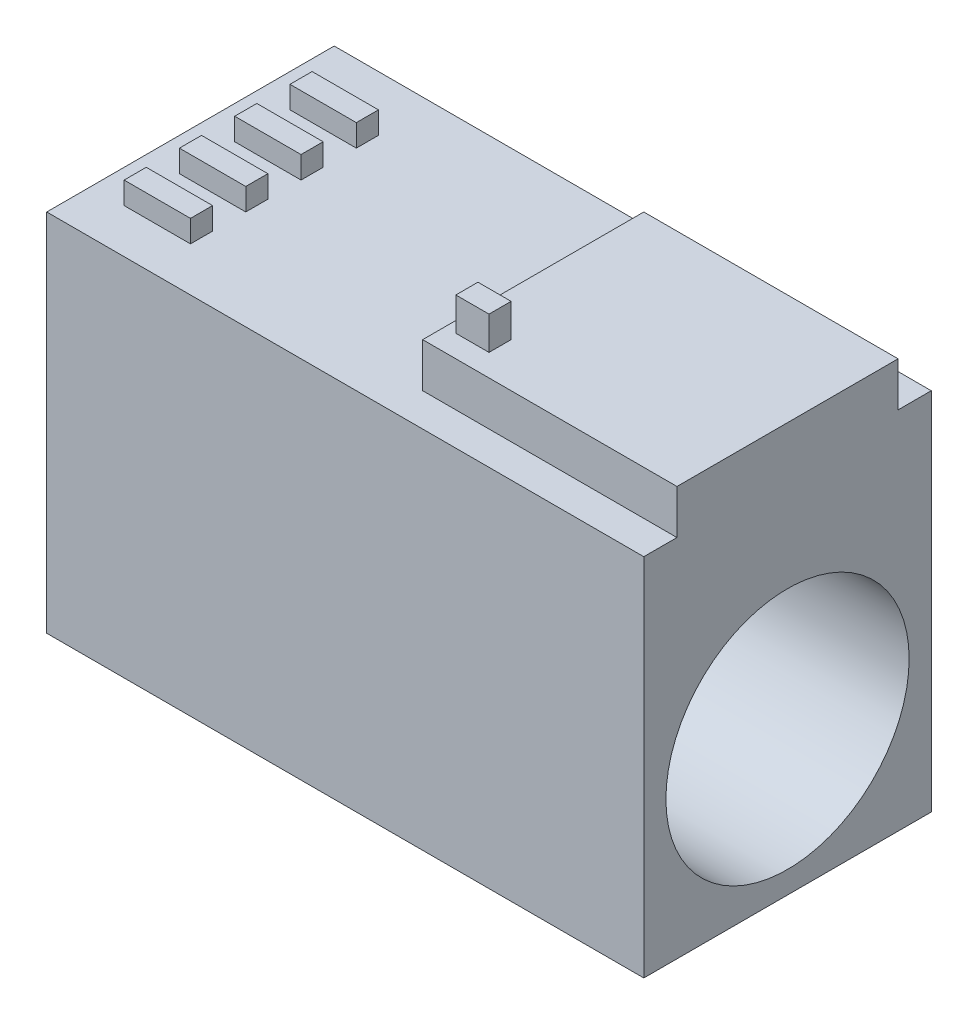
ISO-10303-21;
HEADER;
FILE_DESCRIPTION(('STEP AP214'),'2;1');
FILE_NAME('part.step','',(''),(''),'','','');
FILE_SCHEMA(('AUTOMOTIVE_DESIGN { 1 0 10303 214 1 1 1 1 }'));
ENDSEC;
DATA;
#1=APPLICATION_CONTEXT('core data for automotive mechanical design processes');
#2=APPLICATION_PROTOCOL_DEFINITION('international standard','automotive_design',2000,#1);
#3=PRODUCT_CONTEXT('',#1,'mechanical');
#4=PRODUCT('Part','Part','',(#3));
#5=PRODUCT_RELATED_PRODUCT_CATEGORY('part','',(#4));
#6=PRODUCT_DEFINITION_FORMATION('','',#4);
#7=PRODUCT_DEFINITION_CONTEXT('part definition',#1,'design');
#8=PRODUCT_DEFINITION('design','',#6,#7);
#9=PRODUCT_DEFINITION_SHAPE('','',#8);
#10=(LENGTH_UNIT() NAMED_UNIT(*) SI_UNIT(.MILLI.,.METRE.));
#11=(NAMED_UNIT(*) PLANE_ANGLE_UNIT() SI_UNIT($,.RADIAN.));
#12=(NAMED_UNIT(*) SI_UNIT($,.STERADIAN.) SOLID_ANGLE_UNIT());
#13=UNCERTAINTY_MEASURE_WITH_UNIT(LENGTH_MEASURE(1.E-05),#10,'distance_accuracy_value','');
#14=(GEOMETRIC_REPRESENTATION_CONTEXT(3) GLOBAL_UNCERTAINTY_ASSIGNED_CONTEXT((#13)) GLOBAL_UNIT_ASSIGNED_CONTEXT((#10,
#11,#12)) REPRESENTATION_CONTEXT('',''));
#15=CARTESIAN_POINT('',(0.,0.,0.));
#16=DIRECTION('',(0.,0.,1.));
#17=DIRECTION('',(1.,0.,0.));
#18=AXIS2_PLACEMENT_3D('',#15,#16,#17);
#19=CARTESIAN_POINT('',(20.,185.,130.));
#20=DIRECTION('',(0.,-1.,0.));
#21=DIRECTION('',(0.,0.,-1.));
#22=AXIS2_PLACEMENT_3D('',#19,#20,#21);
#23=PLANE('',#22);
#24=DIRECTION('',(0.,0.,-1.));
#25=VECTOR('',#24,1.);
#26=CARTESIAN_POINT('',(20.,185.,130.));
#27=LINE('',#26,#25);
#28=CARTESIAN_POINT('',(20.,185.,115.));
#29=VERTEX_POINT('',#28);
#30=CARTESIAN_POINT('',(20.,185.,15.));
#31=VERTEX_POINT('',#30);
#32=EDGE_CURVE('E424',#29,#31,#27,.T.);
#33=ORIENTED_EDGE('',*,*,#32,.F.);
#34=DIRECTION('',(-1.,0.,0.));
#35=VECTOR('',#34,1.);
#36=CARTESIAN_POINT('',(135.,185.,115.));
#37=LINE('',#36,#35);
#38=CARTESIAN_POINT('',(135.,185.,115.));
#39=VERTEX_POINT('',#38);
#40=EDGE_CURVE('E376',#39,#29,#37,.T.);
#41=ORIENTED_EDGE('',*,*,#40,.F.);
#42=DIRECTION('',(0.,0.,-1.));
#43=VECTOR('',#42,1.);
#44=CARTESIAN_POINT('',(135.,185.,130.));
#45=LINE('',#44,#43);
#46=CARTESIAN_POINT('',(135.,185.,15.));
#47=VERTEX_POINT('',#46);
#48=EDGE_CURVE('E427',#39,#47,#45,.T.);
#49=ORIENTED_EDGE('',*,*,#48,.T.);
#50=DIRECTION('',(1.,0.,0.));
#51=VECTOR('',#50,1.);
#52=CARTESIAN_POINT('',(135.,185.,15.));
#53=LINE('',#52,#51);
#54=EDGE_CURVE('E375',#31,#47,#53,.T.);
#55=ORIENTED_EDGE('',*,*,#54,.F.);
#56=EDGE_LOOP('',(#33,#41,#49,#55));
#57=FACE_BOUND('',#56,.T.);
#58=DIRECTION('',(0.,0.,1.));
#59=VECTOR('',#58,1.);
#60=CARTESIAN_POINT('',(25.,185.,105.));
#61=LINE('',#60,#59);
#62=CARTESIAN_POINT('',(25.,185.,95.));
#63=VERTEX_POINT('',#62);
#64=CARTESIAN_POINT('',(25.,185.,105.));
#65=VERTEX_POINT('',#64);
#66=EDGE_CURVE('E237',#63,#65,#61,.T.);
#67=ORIENTED_EDGE('',*,*,#66,.F.);
#68=DIRECTION('',(-1.,0.,0.));
#69=VECTOR('',#68,1.);
#70=CARTESIAN_POINT('',(25.,185.,95.));
#71=LINE('',#70,#69);
#72=CARTESIAN_POINT('',(40.,185.,95.));
#73=VERTEX_POINT('',#72);
#74=EDGE_CURVE('E234',#73,#63,#71,.T.);
#75=ORIENTED_EDGE('',*,*,#74,.F.);
#76=DIRECTION('',(0.,0.,-1.));
#77=VECTOR('',#76,1.);
#78=CARTESIAN_POINT('',(40.,185.,105.));
#79=LINE('',#78,#77);
#80=CARTESIAN_POINT('',(40.,185.,105.));
#81=VERTEX_POINT('',#80);
#82=EDGE_CURVE('E52',#81,#73,#79,.T.);
#83=ORIENTED_EDGE('',*,*,#82,.F.);
#84=DIRECTION('',(1.,0.,0.));
#85=VECTOR('',#84,1.);
#86=CARTESIAN_POINT('',(25.,185.,105.));
#87=LINE('',#86,#85);
#88=EDGE_CURVE('E47',#65,#81,#87,.T.);
#89=ORIENTED_EDGE('',*,*,#88,.F.);
#90=EDGE_LOOP('',(#67,#75,#83,#89));
#91=FACE_BOUND('',#90,.T.);
#92=ADVANCED_FACE('F32',(#57,#91),#23,.F.);
#93=CARTESIAN_POINT('',(-135.,165.,130.));
#94=DIRECTION('',(0.,-1.,0.));
#95=DIRECTION('',(0.,0.,-1.));
#96=AXIS2_PLACEMENT_3D('',#93,#94,#95);
#97=PLANE('',#96);
#98=DIRECTION('',(1.,0.,0.));
#99=VECTOR('',#98,1.);
#100=CARTESIAN_POINT('',(-120.,165.,60.));
#101=LINE('',#100,#99);
#102=CARTESIAN_POINT('',(-120.,165.,60.));
#103=VERTEX_POINT('',#102);
#104=CARTESIAN_POINT('',(-90.,165.,60.));
#105=VERTEX_POINT('',#104);
#106=EDGE_CURVE('E276',#103,#105,#101,.T.);
#107=ORIENTED_EDGE('',*,*,#106,.F.);
#108=DIRECTION('',(0.,0.,1.));
#109=VECTOR('',#108,1.);
#110=CARTESIAN_POINT('',(-120.,165.,60.));
#111=LINE('',#110,#109);
#112=CARTESIAN_POINT('',(-120.,165.,50.));
#113=VERTEX_POINT('',#112);
#114=EDGE_CURVE('E281',#113,#103,#111,.T.);
#115=ORIENTED_EDGE('',*,*,#114,.F.);
#116=DIRECTION('',(-1.,0.,0.));
#117=VECTOR('',#116,1.);
#118=CARTESIAN_POINT('',(-120.,165.,50.));
#119=LINE('',#118,#117);
#120=CARTESIAN_POINT('',(-90.,165.,50.));
#121=VERTEX_POINT('',#120);
#122=EDGE_CURVE('E293',#121,#113,#119,.T.);
#123=ORIENTED_EDGE('',*,*,#122,.F.);
#124=DIRECTION('',(0.,0.,-1.));
#125=VECTOR('',#124,1.);
#126=CARTESIAN_POINT('',(-90.,165.,60.));
#127=LINE('',#126,#125);
#128=EDGE_CURVE('E290',#105,#121,#127,.T.);
#129=ORIENTED_EDGE('',*,*,#128,.F.);
#130=EDGE_LOOP('',(#107,#115,#123,#129));
#131=FACE_BOUND('',#130,.T.);
#132=DIRECTION('',(0.,0.,1.));
#133=VECTOR('',#132,1.);
#134=CARTESIAN_POINT('',(-120.,165.,110.));
#135=LINE('',#134,#133);
#136=CARTESIAN_POINT('',(-120.,165.,100.));
#137=VERTEX_POINT('',#136);
#138=CARTESIAN_POINT('',(-120.,165.,110.));
#139=VERTEX_POINT('',#138);
#140=EDGE_CURVE('E342',#137,#139,#135,.T.);
#141=ORIENTED_EDGE('',*,*,#140,.F.);
#142=DIRECTION('',(-1.,0.,0.));
#143=VECTOR('',#142,1.);
#144=CARTESIAN_POINT('',(-120.,165.,100.));
#145=LINE('',#144,#143);
#146=CARTESIAN_POINT('',(-90.,165.,100.));
#147=VERTEX_POINT('',#146);
#148=EDGE_CURVE('E347',#147,#137,#145,.T.);
#149=ORIENTED_EDGE('',*,*,#148,.F.);
#150=DIRECTION('',(0.,0.,-1.));
#151=VECTOR('',#150,1.);
#152=CARTESIAN_POINT('',(-90.,165.,110.));
#153=LINE('',#152,#151);
#154=CARTESIAN_POINT('',(-90.,165.,110.));
#155=VERTEX_POINT('',#154);
#156=EDGE_CURVE('E359',#155,#147,#153,.T.);
#157=ORIENTED_EDGE('',*,*,#156,.F.);
#158=DIRECTION('',(1.,0.,0.));
#159=VECTOR('',#158,1.);
#160=CARTESIAN_POINT('',(-120.,165.,110.));
#161=LINE('',#160,#159);
#162=EDGE_CURVE('E356',#139,#155,#161,.T.);
#163=ORIENTED_EDGE('',*,*,#162,.F.);
#164=EDGE_LOOP('',(#141,#149,#157,#163));
#165=FACE_BOUND('',#164,.T.);
#166=DIRECTION('',(-1.,0.,0.));
#167=VECTOR('',#166,1.);
#168=CARTESIAN_POINT('',(-135.,165.,0.));
#169=LINE('',#168,#167);
#170=CARTESIAN_POINT('',(135.,165.,0.));
#171=VERTEX_POINT('',#170);
#172=CARTESIAN_POINT('',(-135.,165.,0.));
#173=VERTEX_POINT('',#172);
#174=EDGE_CURVE('E390',#171,#173,#169,.T.);
#175=ORIENTED_EDGE('',*,*,#174,.T.);
#176=DIRECTION('',(0.,0.,-1.));
#177=VECTOR('',#176,1.);
#178=CARTESIAN_POINT('',(-135.,165.,130.));
#179=LINE('',#178,#177);
#180=CARTESIAN_POINT('',(-135.,165.,130.));
#181=VERTEX_POINT('',#180);
#182=EDGE_CURVE('E11',#181,#173,#179,.T.);
#183=ORIENTED_EDGE('',*,*,#182,.F.);
#184=DIRECTION('',(-1.,0.,0.));
#185=VECTOR('',#184,1.);
#186=CARTESIAN_POINT('',(-135.,165.,130.));
#187=LINE('',#186,#185);
#188=CARTESIAN_POINT('',(135.,165.,130.));
#189=VERTEX_POINT('',#188);
#190=EDGE_CURVE('E402',#189,#181,#187,.T.);
#191=ORIENTED_EDGE('',*,*,#190,.F.);
#192=DIRECTION('',(0.,0.,-1.));
#193=VECTOR('',#192,1.);
#194=CARTESIAN_POINT('',(135.,165.,130.));
#195=LINE('',#194,#193);
#196=CARTESIAN_POINT('',(135.,165.,115.));
#197=VERTEX_POINT('',#196);
#198=EDGE_CURVE('E383',#189,#197,#195,.T.);
#199=ORIENTED_EDGE('',*,*,#198,.T.);
#200=DIRECTION('',(-1.,0.,0.));
#201=VECTOR('',#200,1.);
#202=CARTESIAN_POINT('',(135.,165.,115.));
#203=LINE('',#202,#201);
#204=CARTESIAN_POINT('',(20.,165.,115.));
#205=VERTEX_POINT('',#204);
#206=EDGE_CURVE('E378',#197,#205,#203,.T.);
#207=ORIENTED_EDGE('',*,*,#206,.T.);
#208=DIRECTION('',(0.,0.,-1.));
#209=VECTOR('',#208,1.);
#210=CARTESIAN_POINT('',(20.,165.,130.));
#211=LINE('',#210,#209);
#212=CARTESIAN_POINT('',(20.,165.,15.));
#213=VERTEX_POINT('',#212);
#214=EDGE_CURVE('E413',#205,#213,#211,.T.);
#215=ORIENTED_EDGE('',*,*,#214,.T.);
#216=DIRECTION('',(1.,0.,0.));
#217=VECTOR('',#216,1.);
#218=CARTESIAN_POINT('',(135.,165.,15.));
#219=LINE('',#218,#217);
#220=CARTESIAN_POINT('',(135.,165.,15.));
#221=VERTEX_POINT('',#220);
#222=EDGE_CURVE('E396',#213,#221,#219,.T.);
#223=ORIENTED_EDGE('',*,*,#222,.T.);
#224=DIRECTION('',(0.,0.,-1.));
#225=VECTOR('',#224,1.);
#226=CARTESIAN_POINT('',(135.,165.,0.));
#227=LINE('',#226,#225);
#228=EDGE_CURVE('E379',#221,#171,#227,.T.);
#229=ORIENTED_EDGE('',*,*,#228,.T.);
#230=EDGE_LOOP('',(#175,#183,#191,#199,#207,#215,#223,#229));
#231=FACE_BOUND('',#230,.T.);
#232=DIRECTION('',(1.,0.,0.));
#233=VECTOR('',#232,1.);
#234=CARTESIAN_POINT('',(-120.,165.,85.));
#235=LINE('',#234,#233);
#236=CARTESIAN_POINT('',(-120.,165.,85.));
#237=VERTEX_POINT('',#236);
#238=CARTESIAN_POINT('',(-90.,165.,85.));
#239=VERTEX_POINT('',#238);
#240=EDGE_CURVE('E309',#237,#239,#235,.T.);
#241=ORIENTED_EDGE('',*,*,#240,.F.);
#242=DIRECTION('',(0.,0.,1.));
#243=VECTOR('',#242,1.);
#244=CARTESIAN_POINT('',(-120.,165.,85.));
#245=LINE('',#244,#243);
#246=CARTESIAN_POINT('',(-120.,165.,75.));
#247=VERTEX_POINT('',#246);
#248=EDGE_CURVE('E314',#247,#237,#245,.T.);
#249=ORIENTED_EDGE('',*,*,#248,.F.);
#250=DIRECTION('',(-1.,0.,0.));
#251=VECTOR('',#250,1.);
#252=CARTESIAN_POINT('',(-120.,165.,75.));
#253=LINE('',#252,#251);
#254=CARTESIAN_POINT('',(-90.,165.,75.));
#255=VERTEX_POINT('',#254);
#256=EDGE_CURVE('E326',#255,#247,#253,.T.);
#257=ORIENTED_EDGE('',*,*,#256,.F.);
#258=DIRECTION('',(0.,0.,-1.));
#259=VECTOR('',#258,1.);
#260=CARTESIAN_POINT('',(-90.,165.,85.));
#261=LINE('',#260,#259);
#262=EDGE_CURVE('E323',#239,#255,#261,.T.);
#263=ORIENTED_EDGE('',*,*,#262,.F.);
#264=EDGE_LOOP('',(#241,#249,#257,#263));
#265=FACE_BOUND('',#264,.T.);
#266=DIRECTION('',(1.,0.,0.));
#267=VECTOR('',#266,1.);
#268=CARTESIAN_POINT('',(-120.,165.,35.));
#269=LINE('',#268,#267);
#270=CARTESIAN_POINT('',(-120.,165.,35.));
#271=VERTEX_POINT('',#270);
#272=CARTESIAN_POINT('',(-90.,165.,35.));
#273=VERTEX_POINT('',#272);
#274=EDGE_CURVE('E238',#271,#273,#269,.T.);
#275=ORIENTED_EDGE('',*,*,#274,.F.);
#276=DIRECTION('',(0.,0.,1.));
#277=VECTOR('',#276,1.);
#278=CARTESIAN_POINT('',(-120.,165.,35.));
#279=LINE('',#278,#277);
#280=CARTESIAN_POINT('',(-120.,165.,25.));
#281=VERTEX_POINT('',#280);
#282=EDGE_CURVE('E251',#281,#271,#279,.T.);
#283=ORIENTED_EDGE('',*,*,#282,.F.);
#284=DIRECTION('',(-1.,0.,0.));
#285=VECTOR('',#284,1.);
#286=CARTESIAN_POINT('',(-120.,165.,25.));
#287=LINE('',#286,#285);
#288=CARTESIAN_POINT('',(-90.,165.,25.));
#289=VERTEX_POINT('',#288);
#290=EDGE_CURVE('E260',#289,#281,#287,.T.);
#291=ORIENTED_EDGE('',*,*,#290,.F.);
#292=DIRECTION('',(0.,0.,-1.));
#293=VECTOR('',#292,1.);
#294=CARTESIAN_POINT('',(-90.,165.,35.));
#295=LINE('',#294,#293);
#296=EDGE_CURVE('E241',#273,#289,#295,.T.);
#297=ORIENTED_EDGE('',*,*,#296,.F.);
#298=EDGE_LOOP('',(#275,#283,#291,#297));
#299=FACE_BOUND('',#298,.T.);
#300=ADVANCED_FACE('F34',(#131,#165,#231,#265,#299),#97,.F.);
#301=CARTESIAN_POINT('',(-135.,0.,130.));
#302=DIRECTION('',(1.,0.,0.));
#303=DIRECTION('',(0.,0.,-1.));
#304=AXIS2_PLACEMENT_3D('',#301,#302,#303);
#305=PLANE('',#304);
#306=CARTESIAN_POINT('',(-135.,65.,65.));
#307=DIRECTION('',(-1.,0.,0.));
#308=DIRECTION('',(0.,0.,1.));
#309=AXIS2_PLACEMENT_3D('',#306,#307,#308);
#310=CIRCLE('',#309,55.);
#311=CARTESIAN_POINT('',(-135.,65.,120.));
#312=VERTEX_POINT('',#311);
#313=EDGE_CURVE('E498',#312,#312,#310,.T.);
#314=ORIENTED_EDGE('',*,*,#313,.F.);
#315=EDGE_LOOP('',(#314));
#316=FACE_BOUND('',#315,.T.);
#317=DIRECTION('',(0.,-1.,0.));
#318=VECTOR('',#317,1.);
#319=CARTESIAN_POINT('',(-135.,0.,0.));
#320=LINE('',#319,#318);
#321=CARTESIAN_POINT('',(-135.,0.,0.));
#322=VERTEX_POINT('',#321);
#323=EDGE_CURVE('E416',#173,#322,#320,.T.);
#324=ORIENTED_EDGE('',*,*,#323,.T.);
#325=DIRECTION('',(0.,0.,-1.));
#326=VECTOR('',#325,1.);
#327=CARTESIAN_POINT('',(-135.,0.,130.));
#328=LINE('',#327,#326);
#329=CARTESIAN_POINT('',(-135.,0.,130.));
#330=VERTEX_POINT('',#329);
#331=EDGE_CURVE('E40',#330,#322,#328,.T.);
#332=ORIENTED_EDGE('',*,*,#331,.F.);
#333=DIRECTION('',(0.,-1.,0.));
#334=VECTOR('',#333,1.);
#335=CARTESIAN_POINT('',(-135.,0.,130.));
#336=LINE('',#335,#334);
#337=EDGE_CURVE('E405',#181,#330,#336,.T.);
#338=ORIENTED_EDGE('',*,*,#337,.F.);
#339=ORIENTED_EDGE('',*,*,#182,.T.);
#340=EDGE_LOOP('',(#324,#332,#338,#339));
#341=FACE_BOUND('',#340,.T.);
#342=ADVANCED_FACE('F452',(#316,#341),#305,.F.);
#343=CARTESIAN_POINT('',(135.,0.,130.));
#344=DIRECTION('',(0.,1.,0.));
#345=DIRECTION('',(0.,0.,1.));
#346=AXIS2_PLACEMENT_3D('',#343,#344,#345);
#347=PLANE('',#346);
#348=DIRECTION('',(1.,0.,0.));
#349=VECTOR('',#348,1.);
#350=CARTESIAN_POINT('',(135.,0.,0.));
#351=LINE('',#350,#349);
#352=CARTESIAN_POINT('',(135.,0.,0.));
#353=VERTEX_POINT('',#352);
#354=EDGE_CURVE('E418',#322,#353,#351,.T.);
#355=ORIENTED_EDGE('',*,*,#354,.T.);
#356=DIRECTION('',(0.,0.,-1.));
#357=VECTOR('',#356,1.);
#358=CARTESIAN_POINT('',(135.,0.,130.));
#359=LINE('',#358,#357);
#360=CARTESIAN_POINT('',(135.,0.,130.));
#361=VERTEX_POINT('',#360);
#362=EDGE_CURVE('E430',#361,#353,#359,.T.);
#363=ORIENTED_EDGE('',*,*,#362,.F.);
#364=DIRECTION('',(1.,0.,0.));
#365=VECTOR('',#364,1.);
#366=CARTESIAN_POINT('',(135.,0.,130.));
#367=LINE('',#366,#365);
#368=EDGE_CURVE('E408',#330,#361,#367,.T.);
#369=ORIENTED_EDGE('',*,*,#368,.F.);
#370=ORIENTED_EDGE('',*,*,#331,.T.);
#371=EDGE_LOOP('',(#355,#363,#369,#370));
#372=FACE_BOUND('',#371,.T.);
#373=ADVANCED_FACE('F437',(#372),#347,.F.);
#374=CARTESIAN_POINT('',(135.,185.,130.));
#375=DIRECTION('',(-1.,0.,0.));
#376=DIRECTION('',(0.,-1.,0.));
#377=AXIS2_PLACEMENT_3D('',#374,#375,#376);
#378=PLANE('',#377);
#379=CARTESIAN_POINT('',(135.,65.,65.));
#380=DIRECTION('',(-1.,0.,0.));
#381=DIRECTION('',(0.,0.,1.));
#382=AXIS2_PLACEMENT_3D('',#379,#380,#381);
#383=CIRCLE('',#382,55.);
#384=CARTESIAN_POINT('',(135.,65.,120.));
#385=VERTEX_POINT('',#384);
#386=EDGE_CURVE('E500',#385,#385,#383,.T.);
#387=ORIENTED_EDGE('',*,*,#386,.T.);
#388=EDGE_LOOP('',(#387));
#389=FACE_BOUND('',#388,.T.);
#390=DIRECTION('',(0.,1.,0.));
#391=VECTOR('',#390,1.);
#392=CARTESIAN_POINT('',(135.,49.0258649525679,115.));
#393=LINE('',#392,#391);
#394=EDGE_CURVE('E386',#197,#39,#393,.T.);
#395=ORIENTED_EDGE('',*,*,#394,.F.);
#396=ORIENTED_EDGE('',*,*,#198,.F.);
#397=DIRECTION('',(0.,1.,0.));
#398=VECTOR('',#397,1.);
#399=CARTESIAN_POINT('',(135.,185.,130.));
#400=LINE('',#399,#398);
#401=EDGE_CURVE('E410',#361,#189,#400,.T.);
#402=ORIENTED_EDGE('',*,*,#401,.F.);
#403=ORIENTED_EDGE('',*,*,#362,.T.);
#404=DIRECTION('',(0.,1.,0.));
#405=VECTOR('',#404,1.);
#406=CARTESIAN_POINT('',(135.,185.,0.));
#407=LINE('',#406,#405);
#408=EDGE_CURVE('E406',#353,#171,#407,.T.);
#409=ORIENTED_EDGE('',*,*,#408,.T.);
#410=ORIENTED_EDGE('',*,*,#228,.F.);
#411=DIRECTION('',(0.,1.,0.));
#412=VECTOR('',#411,1.);
#413=CARTESIAN_POINT('',(135.,49.0258649525679,15.));
#414=LINE('',#413,#412);
#415=EDGE_CURVE('E395',#221,#47,#414,.T.);
#416=ORIENTED_EDGE('',*,*,#415,.T.);
#417=ORIENTED_EDGE('',*,*,#48,.F.);
#418=EDGE_LOOP('',(#395,#396,#402,#403,#409,#410,#416,#417));
#419=FACE_BOUND('',#418,.T.);
#420=ADVANCED_FACE('F446',(#389,#419),#378,.F.);
#421=CARTESIAN_POINT('',(20.,165.,130.));
#422=DIRECTION('',(1.,0.,0.));
#423=DIRECTION('',(0.,1.,0.));
#424=AXIS2_PLACEMENT_3D('',#421,#422,#423);
#425=PLANE('',#424);
#426=ORIENTED_EDGE('',*,*,#214,.F.);
#427=DIRECTION('',(0.,1.,0.));
#428=VECTOR('',#427,1.);
#429=CARTESIAN_POINT('',(20.,49.0258649525679,115.));
#430=LINE('',#429,#428);
#431=EDGE_CURVE('E382',#205,#29,#430,.T.);
#432=ORIENTED_EDGE('',*,*,#431,.T.);
#433=ORIENTED_EDGE('',*,*,#32,.T.);
#434=DIRECTION('',(0.,1.,0.));
#435=VECTOR('',#434,1.);
#436=CARTESIAN_POINT('',(20.,49.0258649525679,15.));
#437=LINE('',#436,#435);
#438=EDGE_CURVE('E392',#213,#31,#437,.T.);
#439=ORIENTED_EDGE('',*,*,#438,.F.);
#440=EDGE_LOOP('',(#426,#432,#433,#439));
#441=FACE_BOUND('',#440,.T.);
#442=ADVANCED_FACE('F461',(#441),#425,.F.);
#443=CARTESIAN_POINT('',(0.,0.,130.));
#444=DIRECTION('',(0.,0.,1.));
#445=DIRECTION('',(1.,0.,0.));
#446=AXIS2_PLACEMENT_3D('',#443,#444,#445);
#447=PLANE('',#446);
#448=ORIENTED_EDGE('',*,*,#401,.T.);
#449=ORIENTED_EDGE('',*,*,#190,.T.);
#450=ORIENTED_EDGE('',*,*,#337,.T.);
#451=ORIENTED_EDGE('',*,*,#368,.T.);
#452=EDGE_LOOP('',(#448,#449,#450,#451));
#453=FACE_BOUND('',#452,.T.);
#454=ADVANCED_FACE('F450',(#453),#447,.T.);
#455=CARTESIAN_POINT('',(0.,0.,0.));
#456=DIRECTION('',(0.,0.,1.));
#457=DIRECTION('',(1.,0.,0.));
#458=AXIS2_PLACEMENT_3D('',#455,#456,#457);
#459=PLANE('',#458);
#460=ORIENTED_EDGE('',*,*,#174,.F.);
#461=ORIENTED_EDGE('',*,*,#408,.F.);
#462=ORIENTED_EDGE('',*,*,#354,.F.);
#463=ORIENTED_EDGE('',*,*,#323,.F.);
#464=EDGE_LOOP('',(#460,#461,#462,#463));
#465=FACE_BOUND('',#464,.T.);
#466=ADVANCED_FACE('F442',(#465),#459,.F.);
#467=CARTESIAN_POINT('',(135.,49.0258649525679,15.));
#468=DIRECTION('',(0.,0.,1.));
#469=DIRECTION('',(1.,0.,0.));
#470=AXIS2_PLACEMENT_3D('',#467,#468,#469);
#471=PLANE('',#470);
#472=ORIENTED_EDGE('',*,*,#438,.T.);
#473=ORIENTED_EDGE('',*,*,#54,.T.);
#474=ORIENTED_EDGE('',*,*,#415,.F.);
#475=ORIENTED_EDGE('',*,*,#222,.F.);
#476=EDGE_LOOP('',(#472,#473,#474,#475));
#477=FACE_BOUND('',#476,.T.);
#478=ADVANCED_FACE('F458',(#477),#471,.F.);
#479=CARTESIAN_POINT('',(135.,49.0258649525679,115.));
#480=DIRECTION('',(0.,0.,-1.));
#481=DIRECTION('',(-1.,0.,0.));
#482=AXIS2_PLACEMENT_3D('',#479,#480,#481);
#483=PLANE('',#482);
#484=ORIENTED_EDGE('',*,*,#394,.T.);
#485=ORIENTED_EDGE('',*,*,#40,.T.);
#486=ORIENTED_EDGE('',*,*,#431,.F.);
#487=ORIENTED_EDGE('',*,*,#206,.F.);
#488=EDGE_LOOP('',(#484,#485,#486,#487));
#489=FACE_BOUND('',#488,.T.);
#490=ADVANCED_FACE('F467',(#489),#483,.F.);
#491=CARTESIAN_POINT('',(-120.,175.,110.));
#492=DIRECTION('',(1.,0.,0.));
#493=DIRECTION('',(0.,0.,-1.));
#494=AXIS2_PLACEMENT_3D('',#491,#492,#493);
#495=PLANE('',#494);
#496=ORIENTED_EDGE('',*,*,#140,.T.);
#497=DIRECTION('',(0.,-1.,0.));
#498=VECTOR('',#497,1.);
#499=CARTESIAN_POINT('',(-120.,175.,110.));
#500=LINE('',#499,#498);
#501=CARTESIAN_POINT('',(-120.,175.,110.));
#502=VERTEX_POINT('',#501);
#503=EDGE_CURVE('E372',#502,#139,#500,.T.);
#504=ORIENTED_EDGE('',*,*,#503,.F.);
#505=DIRECTION('',(0.,0.,1.));
#506=VECTOR('',#505,1.);
#507=CARTESIAN_POINT('',(-120.,175.,110.));
#508=LINE('',#507,#506);
#509=CARTESIAN_POINT('',(-120.,175.,100.));
#510=VERTEX_POINT('',#509);
#511=EDGE_CURVE('E343',#510,#502,#508,.T.);
#512=ORIENTED_EDGE('',*,*,#511,.F.);
#513=DIRECTION('',(0.,-1.,0.));
#514=VECTOR('',#513,1.);
#515=CARTESIAN_POINT('',(-120.,175.,100.));
#516=LINE('',#515,#514);
#517=EDGE_CURVE('E353',#510,#137,#516,.T.);
#518=ORIENTED_EDGE('',*,*,#517,.T.);
#519=EDGE_LOOP('',(#496,#504,#512,#518));
#520=FACE_BOUND('',#519,.T.);
#521=ADVANCED_FACE('F469',(#520),#495,.F.);
#522=CARTESIAN_POINT('',(-120.,175.,110.));
#523=DIRECTION('',(0.,0.,-1.));
#524=DIRECTION('',(-1.,0.,0.));
#525=AXIS2_PLACEMENT_3D('',#522,#523,#524);
#526=PLANE('',#525);
#527=ORIENTED_EDGE('',*,*,#162,.T.);
#528=DIRECTION('',(0.,-1.,0.));
#529=VECTOR('',#528,1.);
#530=CARTESIAN_POINT('',(-90.,175.,110.));
#531=LINE('',#530,#529);
#532=CARTESIAN_POINT('',(-90.,175.,110.));
#533=VERTEX_POINT('',#532);
#534=EDGE_CURVE('E369',#533,#155,#531,.T.);
#535=ORIENTED_EDGE('',*,*,#534,.F.);
#536=DIRECTION('',(1.,0.,0.));
#537=VECTOR('',#536,1.);
#538=CARTESIAN_POINT('',(-120.,175.,110.));
#539=LINE('',#538,#537);
#540=EDGE_CURVE('E346',#502,#533,#539,.T.);
#541=ORIENTED_EDGE('',*,*,#540,.F.);
#542=ORIENTED_EDGE('',*,*,#503,.T.);
#543=EDGE_LOOP('',(#527,#535,#541,#542));
#544=FACE_BOUND('',#543,.T.);
#545=ADVANCED_FACE('F475',(#544),#526,.F.);
#546=CARTESIAN_POINT('',(-90.,175.,110.));
#547=DIRECTION('',(-1.,0.,0.));
#548=DIRECTION('',(0.,0.,1.));
#549=AXIS2_PLACEMENT_3D('',#546,#547,#548);
#550=PLANE('',#549);
#551=ORIENTED_EDGE('',*,*,#156,.T.);
#552=DIRECTION('',(0.,-1.,0.));
#553=VECTOR('',#552,1.);
#554=CARTESIAN_POINT('',(-90.,175.,100.));
#555=LINE('',#554,#553);
#556=CARTESIAN_POINT('',(-90.,175.,100.));
#557=VERTEX_POINT('',#556);
#558=EDGE_CURVE('E366',#557,#147,#555,.T.);
#559=ORIENTED_EDGE('',*,*,#558,.F.);
#560=DIRECTION('',(0.,0.,-1.));
#561=VECTOR('',#560,1.);
#562=CARTESIAN_POINT('',(-90.,175.,110.));
#563=LINE('',#562,#561);
#564=EDGE_CURVE('E349',#533,#557,#563,.T.);
#565=ORIENTED_EDGE('',*,*,#564,.F.);
#566=ORIENTED_EDGE('',*,*,#534,.T.);
#567=EDGE_LOOP('',(#551,#559,#565,#566));
#568=FACE_BOUND('',#567,.T.);
#569=ADVANCED_FACE('F598',(#568),#550,.F.);
#570=CARTESIAN_POINT('',(-120.,175.,100.));
#571=DIRECTION('',(0.,0.,1.));
#572=DIRECTION('',(1.,0.,0.));
#573=AXIS2_PLACEMENT_3D('',#570,#571,#572);
#574=PLANE('',#573);
#575=ORIENTED_EDGE('',*,*,#148,.T.);
#576=ORIENTED_EDGE('',*,*,#517,.F.);
#577=DIRECTION('',(-1.,0.,0.));
#578=VECTOR('',#577,1.);
#579=CARTESIAN_POINT('',(-120.,175.,100.));
#580=LINE('',#579,#578);
#581=EDGE_CURVE('E351',#557,#510,#580,.T.);
#582=ORIENTED_EDGE('',*,*,#581,.F.);
#583=ORIENTED_EDGE('',*,*,#558,.T.);
#584=EDGE_LOOP('',(#575,#576,#582,#583));
#585=FACE_BOUND('',#584,.T.);
#586=ADVANCED_FACE('F594',(#585),#574,.F.);
#587=CARTESIAN_POINT('',(0.,175.,0.));
#588=DIRECTION('',(0.,-1.,0.));
#589=DIRECTION('',(0.,0.,-1.));
#590=AXIS2_PLACEMENT_3D('',#587,#588,#589);
#591=PLANE('',#590);
#592=ORIENTED_EDGE('',*,*,#511,.T.);
#593=ORIENTED_EDGE('',*,*,#540,.T.);
#594=ORIENTED_EDGE('',*,*,#564,.T.);
#595=ORIENTED_EDGE('',*,*,#581,.T.);
#596=EDGE_LOOP('',(#592,#593,#594,#595));
#597=FACE_BOUND('',#596,.T.);
#598=ADVANCED_FACE('F590',(#597),#591,.F.);
#599=CARTESIAN_POINT('',(-120.,175.,85.));
#600=DIRECTION('',(0.,0.,-1.));
#601=DIRECTION('',(-1.,0.,0.));
#602=AXIS2_PLACEMENT_3D('',#599,#600,#601);
#603=PLANE('',#602);
#604=ORIENTED_EDGE('',*,*,#240,.T.);
#605=DIRECTION('',(0.,-1.,0.));
#606=VECTOR('',#605,1.);
#607=CARTESIAN_POINT('',(-90.,175.,85.));
#608=LINE('',#607,#606);
#609=CARTESIAN_POINT('',(-90.,175.,85.));
#610=VERTEX_POINT('',#609);
#611=EDGE_CURVE('E339',#610,#239,#608,.T.);
#612=ORIENTED_EDGE('',*,*,#611,.F.);
#613=DIRECTION('',(1.,0.,0.));
#614=VECTOR('',#613,1.);
#615=CARTESIAN_POINT('',(-120.,175.,85.));
#616=LINE('',#615,#614);
#617=CARTESIAN_POINT('',(-120.,175.,85.));
#618=VERTEX_POINT('',#617);
#619=EDGE_CURVE('E310',#618,#610,#616,.T.);
#620=ORIENTED_EDGE('',*,*,#619,.F.);
#621=DIRECTION('',(0.,-1.,0.));
#622=VECTOR('',#621,1.);
#623=CARTESIAN_POINT('',(-120.,175.,85.));
#624=LINE('',#623,#622);
#625=EDGE_CURVE('E320',#618,#237,#624,.T.);
#626=ORIENTED_EDGE('',*,*,#625,.T.);
#627=EDGE_LOOP('',(#604,#612,#620,#626));
#628=FACE_BOUND('',#627,.T.);
#629=ADVANCED_FACE('F586',(#628),#603,.F.);
#630=CARTESIAN_POINT('',(-90.,175.,85.));
#631=DIRECTION('',(-1.,0.,0.));
#632=DIRECTION('',(0.,0.,1.));
#633=AXIS2_PLACEMENT_3D('',#630,#631,#632);
#634=PLANE('',#633);
#635=ORIENTED_EDGE('',*,*,#262,.T.);
#636=DIRECTION('',(0.,-1.,0.));
#637=VECTOR('',#636,1.);
#638=CARTESIAN_POINT('',(-90.,175.,75.));
#639=LINE('',#638,#637);
#640=CARTESIAN_POINT('',(-90.,175.,75.));
#641=VERTEX_POINT('',#640);
#642=EDGE_CURVE('E336',#641,#255,#639,.T.);
#643=ORIENTED_EDGE('',*,*,#642,.F.);
#644=DIRECTION('',(0.,0.,-1.));
#645=VECTOR('',#644,1.);
#646=CARTESIAN_POINT('',(-90.,175.,85.));
#647=LINE('',#646,#645);
#648=EDGE_CURVE('E313',#610,#641,#647,.T.);
#649=ORIENTED_EDGE('',*,*,#648,.F.);
#650=ORIENTED_EDGE('',*,*,#611,.T.);
#651=EDGE_LOOP('',(#635,#643,#649,#650));
#652=FACE_BOUND('',#651,.T.);
#653=ADVANCED_FACE('F582',(#652),#634,.F.);
#654=CARTESIAN_POINT('',(-120.,175.,75.));
#655=DIRECTION('',(0.,0.,1.));
#656=DIRECTION('',(1.,0.,0.));
#657=AXIS2_PLACEMENT_3D('',#654,#655,#656);
#658=PLANE('',#657);
#659=ORIENTED_EDGE('',*,*,#256,.T.);
#660=DIRECTION('',(0.,-1.,0.));
#661=VECTOR('',#660,1.);
#662=CARTESIAN_POINT('',(-120.,175.,75.));
#663=LINE('',#662,#661);
#664=CARTESIAN_POINT('',(-120.,175.,75.));
#665=VERTEX_POINT('',#664);
#666=EDGE_CURVE('E333',#665,#247,#663,.T.);
#667=ORIENTED_EDGE('',*,*,#666,.F.);
#668=DIRECTION('',(-1.,0.,0.));
#669=VECTOR('',#668,1.);
#670=CARTESIAN_POINT('',(-120.,175.,75.));
#671=LINE('',#670,#669);
#672=EDGE_CURVE('E316',#641,#665,#671,.T.);
#673=ORIENTED_EDGE('',*,*,#672,.F.);
#674=ORIENTED_EDGE('',*,*,#642,.T.);
#675=EDGE_LOOP('',(#659,#667,#673,#674));
#676=FACE_BOUND('',#675,.T.);
#677=ADVANCED_FACE('F578',(#676),#658,.F.);
#678=CARTESIAN_POINT('',(-120.,175.,85.));
#679=DIRECTION('',(1.,0.,0.));
#680=DIRECTION('',(0.,0.,-1.));
#681=AXIS2_PLACEMENT_3D('',#678,#679,#680);
#682=PLANE('',#681);
#683=ORIENTED_EDGE('',*,*,#248,.T.);
#684=ORIENTED_EDGE('',*,*,#625,.F.);
#685=DIRECTION('',(0.,0.,1.));
#686=VECTOR('',#685,1.);
#687=CARTESIAN_POINT('',(-120.,175.,85.));
#688=LINE('',#687,#686);
#689=EDGE_CURVE('E318',#665,#618,#688,.T.);
#690=ORIENTED_EDGE('',*,*,#689,.F.);
#691=ORIENTED_EDGE('',*,*,#666,.T.);
#692=EDGE_LOOP('',(#683,#684,#690,#691));
#693=FACE_BOUND('',#692,.T.);
#694=ADVANCED_FACE('F574',(#693),#682,.F.);
#695=CARTESIAN_POINT('',(0.,175.,0.));
#696=DIRECTION('',(0.,1.,0.));
#697=DIRECTION('',(0.,0.,1.));
#698=AXIS2_PLACEMENT_3D('',#695,#696,#697);
#699=PLANE('',#698);
#700=ORIENTED_EDGE('',*,*,#619,.T.);
#701=ORIENTED_EDGE('',*,*,#648,.T.);
#702=ORIENTED_EDGE('',*,*,#672,.T.);
#703=ORIENTED_EDGE('',*,*,#689,.T.);
#704=EDGE_LOOP('',(#700,#701,#702,#703));
#705=FACE_BOUND('',#704,.T.);
#706=ADVANCED_FACE('F570',(#705),#699,.T.);
#707=CARTESIAN_POINT('',(-120.,175.,60.));
#708=DIRECTION('',(0.,0.,-1.));
#709=DIRECTION('',(-1.,0.,0.));
#710=AXIS2_PLACEMENT_3D('',#707,#708,#709);
#711=PLANE('',#710);
#712=ORIENTED_EDGE('',*,*,#106,.T.);
#713=DIRECTION('',(0.,-1.,0.));
#714=VECTOR('',#713,1.);
#715=CARTESIAN_POINT('',(-90.,175.,60.));
#716=LINE('',#715,#714);
#717=CARTESIAN_POINT('',(-90.,175.,60.));
#718=VERTEX_POINT('',#717);
#719=EDGE_CURVE('E306',#718,#105,#716,.T.);
#720=ORIENTED_EDGE('',*,*,#719,.F.);
#721=DIRECTION('',(1.,0.,0.));
#722=VECTOR('',#721,1.);
#723=CARTESIAN_POINT('',(-120.,175.,60.));
#724=LINE('',#723,#722);
#725=CARTESIAN_POINT('',(-120.,175.,60.));
#726=VERTEX_POINT('',#725);
#727=EDGE_CURVE('E277',#726,#718,#724,.T.);
#728=ORIENTED_EDGE('',*,*,#727,.F.);
#729=DIRECTION('',(0.,-1.,0.));
#730=VECTOR('',#729,1.);
#731=CARTESIAN_POINT('',(-120.,175.,60.));
#732=LINE('',#731,#730);
#733=EDGE_CURVE('E287',#726,#103,#732,.T.);
#734=ORIENTED_EDGE('',*,*,#733,.T.);
#735=EDGE_LOOP('',(#712,#720,#728,#734));
#736=FACE_BOUND('',#735,.T.);
#737=ADVANCED_FACE('F566',(#736),#711,.F.);
#738=CARTESIAN_POINT('',(-90.,175.,60.));
#739=DIRECTION('',(-1.,0.,0.));
#740=DIRECTION('',(0.,0.,1.));
#741=AXIS2_PLACEMENT_3D('',#738,#739,#740);
#742=PLANE('',#741);
#743=ORIENTED_EDGE('',*,*,#128,.T.);
#744=DIRECTION('',(0.,-1.,0.));
#745=VECTOR('',#744,1.);
#746=CARTESIAN_POINT('',(-90.,175.,50.));
#747=LINE('',#746,#745);
#748=CARTESIAN_POINT('',(-90.,175.,50.));
#749=VERTEX_POINT('',#748);
#750=EDGE_CURVE('E303',#749,#121,#747,.T.);
#751=ORIENTED_EDGE('',*,*,#750,.F.);
#752=DIRECTION('',(0.,0.,-1.));
#753=VECTOR('',#752,1.);
#754=CARTESIAN_POINT('',(-90.,175.,60.));
#755=LINE('',#754,#753);
#756=EDGE_CURVE('E280',#718,#749,#755,.T.);
#757=ORIENTED_EDGE('',*,*,#756,.F.);
#758=ORIENTED_EDGE('',*,*,#719,.T.);
#759=EDGE_LOOP('',(#743,#751,#757,#758));
#760=FACE_BOUND('',#759,.T.);
#761=ADVANCED_FACE('F562',(#760),#742,.F.);
#762=CARTESIAN_POINT('',(-120.,175.,50.));
#763=DIRECTION('',(0.,0.,1.));
#764=DIRECTION('',(1.,0.,0.));
#765=AXIS2_PLACEMENT_3D('',#762,#763,#764);
#766=PLANE('',#765);
#767=ORIENTED_EDGE('',*,*,#122,.T.);
#768=DIRECTION('',(0.,-1.,0.));
#769=VECTOR('',#768,1.);
#770=CARTESIAN_POINT('',(-120.,175.,50.));
#771=LINE('',#770,#769);
#772=CARTESIAN_POINT('',(-120.,175.,50.));
#773=VERTEX_POINT('',#772);
#774=EDGE_CURVE('E300',#773,#113,#771,.T.);
#775=ORIENTED_EDGE('',*,*,#774,.F.);
#776=DIRECTION('',(-1.,0.,0.));
#777=VECTOR('',#776,1.);
#778=CARTESIAN_POINT('',(-120.,175.,50.));
#779=LINE('',#778,#777);
#780=EDGE_CURVE('E283',#749,#773,#779,.T.);
#781=ORIENTED_EDGE('',*,*,#780,.F.);
#782=ORIENTED_EDGE('',*,*,#750,.T.);
#783=EDGE_LOOP('',(#767,#775,#781,#782));
#784=FACE_BOUND('',#783,.T.);
#785=ADVANCED_FACE('F558',(#784),#766,.F.);
#786=CARTESIAN_POINT('',(-120.,175.,60.));
#787=DIRECTION('',(1.,0.,0.));
#788=DIRECTION('',(0.,0.,-1.));
#789=AXIS2_PLACEMENT_3D('',#786,#787,#788);
#790=PLANE('',#789);
#791=ORIENTED_EDGE('',*,*,#114,.T.);
#792=ORIENTED_EDGE('',*,*,#733,.F.);
#793=DIRECTION('',(0.,0.,1.));
#794=VECTOR('',#793,1.);
#795=CARTESIAN_POINT('',(-120.,175.,60.));
#796=LINE('',#795,#794);
#797=EDGE_CURVE('E285',#773,#726,#796,.T.);
#798=ORIENTED_EDGE('',*,*,#797,.F.);
#799=ORIENTED_EDGE('',*,*,#774,.T.);
#800=EDGE_LOOP('',(#791,#792,#798,#799));
#801=FACE_BOUND('',#800,.T.);
#802=ADVANCED_FACE('F554',(#801),#790,.F.);
#803=CARTESIAN_POINT('',(0.,175.,0.));
#804=DIRECTION('',(0.,1.,0.));
#805=DIRECTION('',(0.,0.,1.));
#806=AXIS2_PLACEMENT_3D('',#803,#804,#805);
#807=PLANE('',#806);
#808=ORIENTED_EDGE('',*,*,#727,.T.);
#809=ORIENTED_EDGE('',*,*,#756,.T.);
#810=ORIENTED_EDGE('',*,*,#780,.T.);
#811=ORIENTED_EDGE('',*,*,#797,.T.);
#812=EDGE_LOOP('',(#808,#809,#810,#811));
#813=FACE_BOUND('',#812,.T.);
#814=ADVANCED_FACE('F550',(#813),#807,.T.);
#815=CARTESIAN_POINT('',(-120.,175.,35.));
#816=DIRECTION('',(0.,0.,-1.));
#817=DIRECTION('',(-1.,0.,0.));
#818=AXIS2_PLACEMENT_3D('',#815,#816,#817);
#819=PLANE('',#818);
#820=ORIENTED_EDGE('',*,*,#274,.T.);
#821=DIRECTION('',(0.,-1.,0.));
#822=VECTOR('',#821,1.);
#823=CARTESIAN_POINT('',(-90.,175.,35.));
#824=LINE('',#823,#822);
#825=CARTESIAN_POINT('',(-90.,175.,35.));
#826=VERTEX_POINT('',#825);
#827=EDGE_CURVE('E273',#826,#273,#824,.T.);
#828=ORIENTED_EDGE('',*,*,#827,.F.);
#829=DIRECTION('',(1.,0.,0.));
#830=VECTOR('',#829,1.);
#831=CARTESIAN_POINT('',(-120.,175.,35.));
#832=LINE('',#831,#830);
#833=CARTESIAN_POINT('',(-120.,175.,35.));
#834=VERTEX_POINT('',#833);
#835=EDGE_CURVE('E247',#834,#826,#832,.T.);
#836=ORIENTED_EDGE('',*,*,#835,.F.);
#837=DIRECTION('',(0.,-1.,0.));
#838=VECTOR('',#837,1.);
#839=CARTESIAN_POINT('',(-120.,175.,35.));
#840=LINE('',#839,#838);
#841=EDGE_CURVE('E256',#834,#271,#840,.T.);
#842=ORIENTED_EDGE('',*,*,#841,.T.);
#843=EDGE_LOOP('',(#820,#828,#836,#842));
#844=FACE_BOUND('',#843,.T.);
#845=ADVANCED_FACE('F546',(#844),#819,.F.);
#846=CARTESIAN_POINT('',(-90.,175.,35.));
#847=DIRECTION('',(-1.,0.,0.));
#848=DIRECTION('',(0.,0.,1.));
#849=AXIS2_PLACEMENT_3D('',#846,#847,#848);
#850=PLANE('',#849);
#851=ORIENTED_EDGE('',*,*,#296,.T.);
#852=DIRECTION('',(0.,-1.,0.));
#853=VECTOR('',#852,1.);
#854=CARTESIAN_POINT('',(-90.,175.,25.));
#855=LINE('',#854,#853);
#856=CARTESIAN_POINT('',(-90.,175.,25.));
#857=VERTEX_POINT('',#856);
#858=EDGE_CURVE('E270',#857,#289,#855,.T.);
#859=ORIENTED_EDGE('',*,*,#858,.F.);
#860=DIRECTION('',(0.,0.,-1.));
#861=VECTOR('',#860,1.);
#862=CARTESIAN_POINT('',(-90.,175.,35.));
#863=LINE('',#862,#861);
#864=EDGE_CURVE('E250',#826,#857,#863,.T.);
#865=ORIENTED_EDGE('',*,*,#864,.F.);
#866=ORIENTED_EDGE('',*,*,#827,.T.);
#867=EDGE_LOOP('',(#851,#859,#865,#866));
#868=FACE_BOUND('',#867,.T.);
#869=ADVANCED_FACE('F542',(#868),#850,.F.);
#870=CARTESIAN_POINT('',(-120.,175.,25.));
#871=DIRECTION('',(0.,0.,1.));
#872=DIRECTION('',(1.,0.,0.));
#873=AXIS2_PLACEMENT_3D('',#870,#871,#872);
#874=PLANE('',#873);
#875=ORIENTED_EDGE('',*,*,#290,.T.);
#876=DIRECTION('',(0.,-1.,0.));
#877=VECTOR('',#876,1.);
#878=CARTESIAN_POINT('',(-120.,175.,25.));
#879=LINE('',#878,#877);
#880=CARTESIAN_POINT('',(-120.,175.,25.));
#881=VERTEX_POINT('',#880);
#882=EDGE_CURVE('E267',#881,#281,#879,.T.);
#883=ORIENTED_EDGE('',*,*,#882,.F.);
#884=DIRECTION('',(-1.,0.,0.));
#885=VECTOR('',#884,1.);
#886=CARTESIAN_POINT('',(-120.,175.,25.));
#887=LINE('',#886,#885);
#888=EDGE_CURVE('E253',#857,#881,#887,.T.);
#889=ORIENTED_EDGE('',*,*,#888,.F.);
#890=ORIENTED_EDGE('',*,*,#858,.T.);
#891=EDGE_LOOP('',(#875,#883,#889,#890));
#892=FACE_BOUND('',#891,.T.);
#893=ADVANCED_FACE('F538',(#892),#874,.F.);
#894=CARTESIAN_POINT('',(-120.,175.,35.));
#895=DIRECTION('',(1.,0.,0.));
#896=DIRECTION('',(0.,0.,-1.));
#897=AXIS2_PLACEMENT_3D('',#894,#895,#896);
#898=PLANE('',#897);
#899=ORIENTED_EDGE('',*,*,#282,.T.);
#900=ORIENTED_EDGE('',*,*,#841,.F.);
#901=DIRECTION('',(0.,0.,1.));
#902=VECTOR('',#901,1.);
#903=CARTESIAN_POINT('',(-120.,175.,35.));
#904=LINE('',#903,#902);
#905=EDGE_CURVE('E255',#881,#834,#904,.T.);
#906=ORIENTED_EDGE('',*,*,#905,.F.);
#907=ORIENTED_EDGE('',*,*,#882,.T.);
#908=EDGE_LOOP('',(#899,#900,#906,#907));
#909=FACE_BOUND('',#908,.T.);
#910=ADVANCED_FACE('F534',(#909),#898,.F.);
#911=CARTESIAN_POINT('',(0.,175.,0.));
#912=DIRECTION('',(0.,1.,0.));
#913=DIRECTION('',(0.,0.,1.));
#914=AXIS2_PLACEMENT_3D('',#911,#912,#913);
#915=PLANE('',#914);
#916=ORIENTED_EDGE('',*,*,#835,.T.);
#917=ORIENTED_EDGE('',*,*,#864,.T.);
#918=ORIENTED_EDGE('',*,*,#888,.T.);
#919=ORIENTED_EDGE('',*,*,#905,.T.);
#920=EDGE_LOOP('',(#916,#917,#918,#919));
#921=FACE_BOUND('',#920,.T.);
#922=ADVANCED_FACE('F531',(#921),#915,.T.);
#923=CARTESIAN_POINT('',(25.,200.,105.));
#924=DIRECTION('',(1.,0.,0.));
#925=DIRECTION('',(0.,0.,-1.));
#926=AXIS2_PLACEMENT_3D('',#923,#924,#925);
#927=PLANE('',#926);
#928=ORIENTED_EDGE('',*,*,#66,.T.);
#929=DIRECTION('',(0.,-1.,0.));
#930=VECTOR('',#929,1.);
#931=CARTESIAN_POINT('',(25.,200.,105.));
#932=LINE('',#931,#930);
#933=CARTESIAN_POINT('',(25.,200.,105.));
#934=VERTEX_POINT('',#933);
#935=EDGE_CURVE('E218',#934,#65,#932,.T.);
#936=ORIENTED_EDGE('',*,*,#935,.F.);
#937=DIRECTION('',(0.,0.,1.));
#938=VECTOR('',#937,1.);
#939=CARTESIAN_POINT('',(25.,200.,105.));
#940=LINE('',#939,#938);
#941=CARTESIAN_POINT('',(25.,200.,95.));
#942=VERTEX_POINT('',#941);
#943=EDGE_CURVE('E225',#942,#934,#940,.T.);
#944=ORIENTED_EDGE('',*,*,#943,.F.);
#945=DIRECTION('',(0.,-1.,0.));
#946=VECTOR('',#945,1.);
#947=CARTESIAN_POINT('',(25.,200.,95.));
#948=LINE('',#947,#946);
#949=EDGE_CURVE('E507',#942,#63,#948,.T.);
#950=ORIENTED_EDGE('',*,*,#949,.T.);
#951=EDGE_LOOP('',(#928,#936,#944,#950));
#952=FACE_BOUND('',#951,.T.);
#953=ADVANCED_FACE('F236',(#952),#927,.F.);
#954=CARTESIAN_POINT('',(25.,200.,105.));
#955=DIRECTION('',(0.,0.,-1.));
#956=DIRECTION('',(-1.,0.,0.));
#957=AXIS2_PLACEMENT_3D('',#954,#955,#956);
#958=PLANE('',#957);
#959=ORIENTED_EDGE('',*,*,#88,.T.);
#960=DIRECTION('',(0.,-1.,0.));
#961=VECTOR('',#960,1.);
#962=CARTESIAN_POINT('',(40.,200.,105.));
#963=LINE('',#962,#961);
#964=CARTESIAN_POINT('',(40.,200.,105.));
#965=VERTEX_POINT('',#964);
#966=EDGE_CURVE('E221',#965,#81,#963,.T.);
#967=ORIENTED_EDGE('',*,*,#966,.F.);
#968=DIRECTION('',(1.,0.,0.));
#969=VECTOR('',#968,1.);
#970=CARTESIAN_POINT('',(25.,200.,105.));
#971=LINE('',#970,#969);
#972=EDGE_CURVE('E214',#934,#965,#971,.T.);
#973=ORIENTED_EDGE('',*,*,#972,.F.);
#974=ORIENTED_EDGE('',*,*,#935,.T.);
#975=EDGE_LOOP('',(#959,#967,#973,#974));
#976=FACE_BOUND('',#975,.T.);
#977=ADVANCED_FACE('F216',(#976),#958,.F.);
#978=CARTESIAN_POINT('',(40.,200.,105.));
#979=DIRECTION('',(-1.,0.,0.));
#980=DIRECTION('',(0.,0.,1.));
#981=AXIS2_PLACEMENT_3D('',#978,#979,#980);
#982=PLANE('',#981);
#983=ORIENTED_EDGE('',*,*,#82,.T.);
#984=DIRECTION('',(0.,-1.,0.));
#985=VECTOR('',#984,1.);
#986=CARTESIAN_POINT('',(40.,200.,95.));
#987=LINE('',#986,#985);
#988=CARTESIAN_POINT('',(40.,200.,95.));
#989=VERTEX_POINT('',#988);
#990=EDGE_CURVE('E243',#989,#73,#987,.T.);
#991=ORIENTED_EDGE('',*,*,#990,.F.);
#992=DIRECTION('',(0.,0.,-1.));
#993=VECTOR('',#992,1.);
#994=CARTESIAN_POINT('',(40.,200.,105.));
#995=LINE('',#994,#993);
#996=EDGE_CURVE('E224',#965,#989,#995,.T.);
#997=ORIENTED_EDGE('',*,*,#996,.F.);
#998=ORIENTED_EDGE('',*,*,#966,.T.);
#999=EDGE_LOOP('',(#983,#991,#997,#998));
#1000=FACE_BOUND('',#999,.T.);
#1001=ADVANCED_FACE('F518',(#1000),#982,.F.);
#1002=CARTESIAN_POINT('',(25.,200.,95.));
#1003=DIRECTION('',(0.,0.,1.));
#1004=DIRECTION('',(1.,0.,0.));
#1005=AXIS2_PLACEMENT_3D('',#1002,#1003,#1004);
#1006=PLANE('',#1005);
#1007=ORIENTED_EDGE('',*,*,#74,.T.);
#1008=ORIENTED_EDGE('',*,*,#949,.F.);
#1009=DIRECTION('',(-1.,0.,0.));
#1010=VECTOR('',#1009,1.);
#1011=CARTESIAN_POINT('',(25.,200.,95.));
#1012=LINE('',#1011,#1010);
#1013=EDGE_CURVE('E230',#989,#942,#1012,.T.);
#1014=ORIENTED_EDGE('',*,*,#1013,.F.);
#1015=ORIENTED_EDGE('',*,*,#990,.T.);
#1016=EDGE_LOOP('',(#1007,#1008,#1014,#1015));
#1017=FACE_BOUND('',#1016,.T.);
#1018=ADVANCED_FACE('F516',(#1017),#1006,.F.);
#1019=CARTESIAN_POINT('',(0.,200.,0.));
#1020=DIRECTION('',(0.,-1.,0.));
#1021=DIRECTION('',(0.,0.,-1.));
#1022=AXIS2_PLACEMENT_3D('',#1019,#1020,#1021);
#1023=PLANE('',#1022);
#1024=ORIENTED_EDGE('',*,*,#943,.T.);
#1025=ORIENTED_EDGE('',*,*,#972,.T.);
#1026=ORIENTED_EDGE('',*,*,#996,.T.);
#1027=ORIENTED_EDGE('',*,*,#1013,.T.);
#1028=EDGE_LOOP('',(#1024,#1025,#1026,#1027));
#1029=FACE_BOUND('',#1028,.T.);
#1030=ADVANCED_FACE('F228',(#1029),#1023,.F.);
#1031=CARTESIAN_POINT('',(135.,65.,65.));
#1032=DIRECTION('',(-1.,0.,0.));
#1033=DIRECTION('',(0.,0.,1.));
#1034=AXIS2_PLACEMENT_3D('',#1031,#1032,#1033);
#1035=CYLINDRICAL_SURFACE('',#1034,55.);
#1036=ORIENTED_EDGE('',*,*,#386,.F.);
#1037=EDGE_LOOP('',(#1036));
#1038=FACE_BOUND('',#1037,.T.);
#1039=ORIENTED_EDGE('',*,*,#313,.T.);
#1040=EDGE_LOOP('',(#1039));
#1041=FACE_BOUND('',#1040,.T.);
#1042=ADVANCED_FACE('F715',(#1038,#1041),#1035,.F.);
#1043=CLOSED_SHELL('',(#92,#300,#342,#373,#420,#442,#454,#466,#478,#490,#521,#545,#569,#586,
#598,#629,#653,#677,#694,#706,#737,#761,#785,#802,#814,#845,#869,#893,#910,#922,#953,#977,#1001,
#1018,#1030,#1042));
#1044=MANIFOLD_SOLID_BREP('B2',#1043);
#1045=ADVANCED_BREP_SHAPE_REPRESENTATION('',(#18,#1044),#14);
#1046=SHAPE_DEFINITION_REPRESENTATION(#9,#1045);
ENDSEC;
END-ISO-10303-21;
